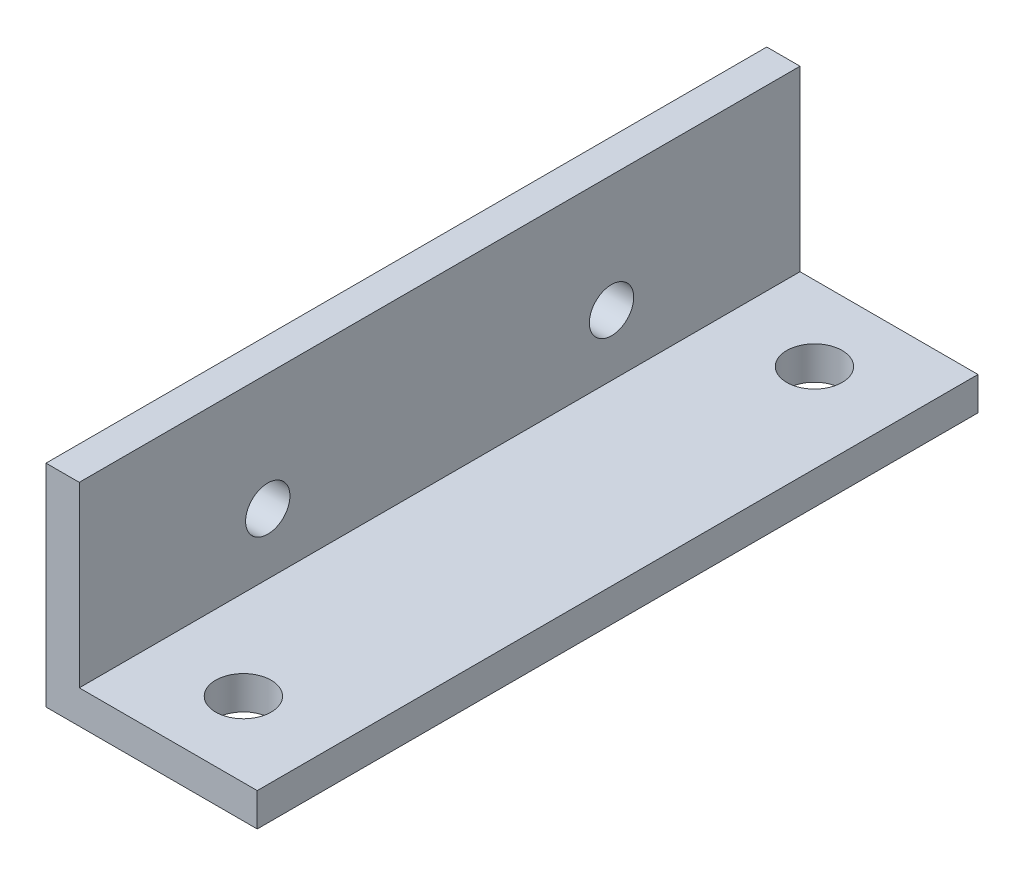
ISO-10303-21;
HEADER;
FILE_DESCRIPTION(('STEP AP214'),'2;1');
FILE_NAME('part.step','',(''),(''),'','','');
FILE_SCHEMA(('AUTOMOTIVE_DESIGN { 1 0 10303 214 1 1 1 1 }'));
ENDSEC;
DATA;
#1=APPLICATION_CONTEXT('core data for automotive mechanical design processes');
#2=APPLICATION_PROTOCOL_DEFINITION('international standard','automotive_design',2000,#1);
#3=PRODUCT_CONTEXT('',#1,'mechanical');
#4=PRODUCT('Part','Part','',(#3));
#5=PRODUCT_RELATED_PRODUCT_CATEGORY('part','',(#4));
#6=PRODUCT_DEFINITION_FORMATION('','',#4);
#7=PRODUCT_DEFINITION_CONTEXT('part definition',#1,'design');
#8=PRODUCT_DEFINITION('design','',#6,#7);
#9=PRODUCT_DEFINITION_SHAPE('','',#8);
#10=(LENGTH_UNIT() NAMED_UNIT(*) SI_UNIT(.MILLI.,.METRE.));
#11=(NAMED_UNIT(*) PLANE_ANGLE_UNIT() SI_UNIT($,.RADIAN.));
#12=(NAMED_UNIT(*) SI_UNIT($,.STERADIAN.) SOLID_ANGLE_UNIT());
#13=UNCERTAINTY_MEASURE_WITH_UNIT(LENGTH_MEASURE(1.E-05),#10,'distance_accuracy_value','');
#14=(GEOMETRIC_REPRESENTATION_CONTEXT(3) GLOBAL_UNCERTAINTY_ASSIGNED_CONTEXT((#13)) GLOBAL_UNIT_ASSIGNED_CONTEXT((#10,
#11,#12)) REPRESENTATION_CONTEXT('',''));
#15=CARTESIAN_POINT('',(0.,0.,0.));
#16=DIRECTION('',(0.,0.,1.));
#17=DIRECTION('',(1.,0.,0.));
#18=AXIS2_PLACEMENT_3D('',#15,#16,#17);
#19=CARTESIAN_POINT('',(3.,0.,32.5));
#20=DIRECTION('',(-1.,0.,0.));
#21=DIRECTION('',(0.,0.,1.));
#22=AXIS2_PLACEMENT_3D('',#19,#20,#21);
#23=PLANE('',#22);
#24=CARTESIAN_POINT('',(3.,8.5,15.5));
#25=DIRECTION('',(-1.,0.,0.));
#26=DIRECTION('',(0.,0.,1.));
#27=AXIS2_PLACEMENT_3D('',#24,#25,#26);
#28=CIRCLE('',#27,2.);
#29=CARTESIAN_POINT('',(3.,8.5,17.5));
#30=VERTEX_POINT('',#29);
#31=EDGE_CURVE('E164',#30,#30,#28,.F.);
#32=ORIENTED_EDGE('',*,*,#31,.F.);
#33=EDGE_LOOP('',(#32));
#34=FACE_BOUND('',#33,.T.);
#35=CARTESIAN_POINT('',(3.,8.5,-15.5));
#36=DIRECTION('',(-1.,0.,0.));
#37=DIRECTION('',(0.,0.,1.));
#38=AXIS2_PLACEMENT_3D('',#35,#36,#37);
#39=CIRCLE('',#38,2.);
#40=CARTESIAN_POINT('',(3.,8.5,-13.5));
#41=VERTEX_POINT('',#40);
#42=EDGE_CURVE('E120',#41,#41,#39,.F.);
#43=ORIENTED_EDGE('',*,*,#42,.F.);
#44=EDGE_LOOP('',(#43));
#45=FACE_BOUND('',#44,.T.);
#46=DIRECTION('',(0.,1.,0.));
#47=VECTOR('',#46,1.);
#48=CARTESIAN_POINT('',(3.,0.,-32.5));
#49=LINE('',#48,#47);
#50=CARTESIAN_POINT('',(3.,3.,-32.5));
#51=VERTEX_POINT('',#50);
#52=CARTESIAN_POINT('',(3.,19.05,-32.5));
#53=VERTEX_POINT('',#52);
#54=EDGE_CURVE('E116',#51,#53,#49,.T.);
#55=ORIENTED_EDGE('',*,*,#54,.T.);
#56=DIRECTION('',(0.,0.,-1.));
#57=VECTOR('',#56,1.);
#58=CARTESIAN_POINT('',(3.,19.05,32.5));
#59=LINE('',#58,#57);
#60=CARTESIAN_POINT('',(3.,19.05,32.5));
#61=VERTEX_POINT('',#60);
#62=EDGE_CURVE('E11',#61,#53,#59,.T.);
#63=ORIENTED_EDGE('',*,*,#62,.F.);
#64=DIRECTION('',(0.,1.,0.));
#65=VECTOR('',#64,1.);
#66=CARTESIAN_POINT('',(3.,0.,32.5));
#67=LINE('',#66,#65);
#68=CARTESIAN_POINT('',(3.,3.,32.5));
#69=VERTEX_POINT('',#68);
#70=EDGE_CURVE('E81',#69,#61,#67,.T.);
#71=ORIENTED_EDGE('',*,*,#70,.F.);
#72=DIRECTION('',(0.,0.,-1.));
#73=VECTOR('',#72,1.);
#74=CARTESIAN_POINT('',(3.,3.,32.5));
#75=LINE('',#74,#73);
#76=EDGE_CURVE('E112',#69,#51,#75,.T.);
#77=ORIENTED_EDGE('',*,*,#76,.T.);
#78=EDGE_LOOP('',(#55,#63,#71,#77));
#79=FACE_BOUND('',#78,.T.);
#80=ADVANCED_FACE('F35',(#34,#45,#79),#23,.F.);
#81=CARTESIAN_POINT('',(0.,19.05,32.5));
#82=DIRECTION('',(0.,1.,0.));
#83=DIRECTION('',(0.,0.,1.));
#84=AXIS2_PLACEMENT_3D('',#81,#82,#83);
#85=PLANE('',#84);
#86=DIRECTION('',(1.,0.,0.));
#87=VECTOR('',#86,1.);
#88=CARTESIAN_POINT('',(0.,19.05,-32.5));
#89=LINE('',#88,#87);
#90=CARTESIAN_POINT('',(0.,19.05,-32.5));
#91=VERTEX_POINT('',#90);
#92=EDGE_CURVE('E119',#91,#53,#89,.T.);
#93=ORIENTED_EDGE('',*,*,#92,.F.);
#94=DIRECTION('',(0.,0.,-1.));
#95=VECTOR('',#94,1.);
#96=CARTESIAN_POINT('',(0.,19.05,32.5));
#97=LINE('',#96,#95);
#98=CARTESIAN_POINT('',(0.,19.05,32.5));
#99=VERTEX_POINT('',#98);
#100=EDGE_CURVE('E43',#99,#91,#97,.T.);
#101=ORIENTED_EDGE('',*,*,#100,.F.);
#102=DIRECTION('',(1.,0.,0.));
#103=VECTOR('',#102,1.);
#104=CARTESIAN_POINT('',(0.,19.05,32.5));
#105=LINE('',#104,#103);
#106=EDGE_CURVE('E175',#99,#61,#105,.T.);
#107=ORIENTED_EDGE('',*,*,#106,.T.);
#108=ORIENTED_EDGE('',*,*,#62,.T.);
#109=EDGE_LOOP('',(#93,#101,#107,#108));
#110=FACE_BOUND('',#109,.T.);
#111=ADVANCED_FACE('F138',(#110),#85,.T.);
#112=CARTESIAN_POINT('',(0.,0.,32.5));
#113=DIRECTION('',(-1.,0.,0.));
#114=DIRECTION('',(0.,0.,1.));
#115=AXIS2_PLACEMENT_3D('',#112,#113,#114);
#116=PLANE('',#115);
#117=CARTESIAN_POINT('',(0.,8.5,15.5));
#118=DIRECTION('',(-1.,0.,0.));
#119=DIRECTION('',(0.,0.,1.));
#120=AXIS2_PLACEMENT_3D('',#117,#118,#119);
#121=CIRCLE('',#120,2.);
#122=CARTESIAN_POINT('',(0.,8.5,17.5));
#123=VERTEX_POINT('',#122);
#124=EDGE_CURVE('E177',#123,#123,#121,.T.);
#125=ORIENTED_EDGE('',*,*,#124,.F.);
#126=EDGE_LOOP('',(#125));
#127=FACE_BOUND('',#126,.T.);
#128=CARTESIAN_POINT('',(0.,8.5,-15.5));
#129=DIRECTION('',(-1.,0.,0.));
#130=DIRECTION('',(0.,0.,1.));
#131=AXIS2_PLACEMENT_3D('',#128,#129,#130);
#132=CIRCLE('',#131,2.);
#133=CARTESIAN_POINT('',(0.,8.5,-13.5));
#134=VERTEX_POINT('',#133);
#135=EDGE_CURVE('E168',#134,#134,#132,.T.);
#136=ORIENTED_EDGE('',*,*,#135,.F.);
#137=EDGE_LOOP('',(#136));
#138=FACE_BOUND('',#137,.T.);
#139=DIRECTION('',(0.,1.,0.));
#140=VECTOR('',#139,1.);
#141=CARTESIAN_POINT('',(0.,0.,-32.5));
#142=LINE('',#141,#140);
#143=CARTESIAN_POINT('',(0.,0.,-32.5));
#144=VERTEX_POINT('',#143);
#145=EDGE_CURVE('E123',#144,#91,#142,.T.);
#146=ORIENTED_EDGE('',*,*,#145,.F.);
#147=DIRECTION('',(0.,0.,-1.));
#148=VECTOR('',#147,1.);
#149=CARTESIAN_POINT('',(0.,0.,32.5));
#150=LINE('',#149,#148);
#151=CARTESIAN_POINT('',(0.,0.,32.5));
#152=VERTEX_POINT('',#151);
#153=EDGE_CURVE('E102',#152,#144,#150,.T.);
#154=ORIENTED_EDGE('',*,*,#153,.F.);
#155=DIRECTION('',(0.,1.,0.));
#156=VECTOR('',#155,1.);
#157=CARTESIAN_POINT('',(0.,0.,32.5));
#158=LINE('',#157,#156);
#159=EDGE_CURVE('E108',#152,#99,#158,.T.);
#160=ORIENTED_EDGE('',*,*,#159,.T.);
#161=ORIENTED_EDGE('',*,*,#100,.T.);
#162=EDGE_LOOP('',(#146,#154,#160,#161));
#163=FACE_BOUND('',#162,.T.);
#164=ADVANCED_FACE('F135',(#127,#138,#163),#116,.T.);
#165=CARTESIAN_POINT('',(19.05,0.,32.5));
#166=DIRECTION('',(0.,-1.,0.));
#167=DIRECTION('',(0.,0.,-1.));
#168=AXIS2_PLACEMENT_3D('',#165,#166,#167);
#169=PLANE('',#168);
#170=CARTESIAN_POINT('',(11.05,0.,25.75));
#171=DIRECTION('',(0.,-1.,0.));
#172=DIRECTION('',(0.,0.,-1.));
#173=AXIS2_PLACEMENT_3D('',#170,#171,#172);
#174=CIRCLE('',#173,2.49999999999999);
#175=CARTESIAN_POINT('',(11.05,0.,23.25));
#176=VERTEX_POINT('',#175);
#177=EDGE_CURVE('E189',#176,#176,#174,.T.);
#178=ORIENTED_EDGE('',*,*,#177,.F.);
#179=EDGE_LOOP('',(#178));
#180=FACE_BOUND('',#179,.T.);
#181=CARTESIAN_POINT('',(11.05,0.,-25.75));
#182=DIRECTION('',(0.,-1.,0.));
#183=DIRECTION('',(0.,0.,-1.));
#184=AXIS2_PLACEMENT_3D('',#181,#182,#183);
#185=CIRCLE('',#184,2.49999999999999);
#186=CARTESIAN_POINT('',(11.05,0.,-28.25));
#187=VERTEX_POINT('',#186);
#188=EDGE_CURVE('E183',#187,#187,#185,.T.);
#189=ORIENTED_EDGE('',*,*,#188,.F.);
#190=EDGE_LOOP('',(#189));
#191=FACE_BOUND('',#190,.T.);
#192=DIRECTION('',(-1.,0.,0.));
#193=VECTOR('',#192,1.);
#194=CARTESIAN_POINT('',(19.05,0.,-32.5));
#195=LINE('',#194,#193);
#196=CARTESIAN_POINT('',(19.05,0.,-32.5));
#197=VERTEX_POINT('',#196);
#198=EDGE_CURVE('E97',#197,#144,#195,.T.);
#199=ORIENTED_EDGE('',*,*,#198,.F.);
#200=DIRECTION('',(0.,0.,-1.));
#201=VECTOR('',#200,1.);
#202=CARTESIAN_POINT('',(19.05,0.,32.5));
#203=LINE('',#202,#201);
#204=CARTESIAN_POINT('',(19.05,0.,32.5));
#205=VERTEX_POINT('',#204);
#206=EDGE_CURVE('E92',#205,#197,#203,.T.);
#207=ORIENTED_EDGE('',*,*,#206,.F.);
#208=DIRECTION('',(-1.,0.,0.));
#209=VECTOR('',#208,1.);
#210=CARTESIAN_POINT('',(19.05,0.,32.5));
#211=LINE('',#210,#209);
#212=EDGE_CURVE('E95',#205,#152,#211,.T.);
#213=ORIENTED_EDGE('',*,*,#212,.T.);
#214=ORIENTED_EDGE('',*,*,#153,.T.);
#215=EDGE_LOOP('',(#199,#207,#213,#214));
#216=FACE_BOUND('',#215,.T.);
#217=ADVANCED_FACE('F94',(#180,#191,#216),#169,.T.);
#218=CARTESIAN_POINT('',(19.05,3.,32.5));
#219=DIRECTION('',(1.,0.,0.));
#220=DIRECTION('',(0.,0.,-1.));
#221=AXIS2_PLACEMENT_3D('',#218,#219,#220);
#222=PLANE('',#221);
#223=DIRECTION('',(0.,-1.,0.));
#224=VECTOR('',#223,1.);
#225=CARTESIAN_POINT('',(19.05,3.,-32.5));
#226=LINE('',#225,#224);
#227=CARTESIAN_POINT('',(19.05,3.,-32.5));
#228=VERTEX_POINT('',#227);
#229=EDGE_CURVE('E127',#228,#197,#226,.T.);
#230=ORIENTED_EDGE('',*,*,#229,.F.);
#231=DIRECTION('',(0.,0.,-1.));
#232=VECTOR('',#231,1.);
#233=CARTESIAN_POINT('',(19.05,3.,32.5));
#234=LINE('',#233,#232);
#235=CARTESIAN_POINT('',(19.05,3.,32.5));
#236=VERTEX_POINT('',#235);
#237=EDGE_CURVE('E72',#236,#228,#234,.T.);
#238=ORIENTED_EDGE('',*,*,#237,.F.);
#239=DIRECTION('',(0.,-1.,0.));
#240=VECTOR('',#239,1.);
#241=CARTESIAN_POINT('',(19.05,3.,32.5));
#242=LINE('',#241,#240);
#243=EDGE_CURVE('E106',#236,#205,#242,.T.);
#244=ORIENTED_EDGE('',*,*,#243,.T.);
#245=ORIENTED_EDGE('',*,*,#206,.T.);
#246=EDGE_LOOP('',(#230,#238,#244,#245));
#247=FACE_BOUND('',#246,.T.);
#248=ADVANCED_FACE('F110',(#247),#222,.T.);
#249=CARTESIAN_POINT('',(19.05,3.,32.5));
#250=DIRECTION('',(0.,-1.,0.));
#251=DIRECTION('',(0.,0.,-1.));
#252=AXIS2_PLACEMENT_3D('',#249,#250,#251);
#253=PLANE('',#252);
#254=CARTESIAN_POINT('',(11.05,3.,25.75));
#255=DIRECTION('',(0.,-1.,0.));
#256=DIRECTION('',(0.,0.,-1.));
#257=AXIS2_PLACEMENT_3D('',#254,#255,#256);
#258=CIRCLE('',#257,2.49999999999999);
#259=CARTESIAN_POINT('',(11.05,3.,23.25));
#260=VERTEX_POINT('',#259);
#261=EDGE_CURVE('E186',#260,#260,#258,.F.);
#262=ORIENTED_EDGE('',*,*,#261,.F.);
#263=EDGE_LOOP('',(#262));
#264=FACE_BOUND('',#263,.T.);
#265=CARTESIAN_POINT('',(11.05,3.,-25.75));
#266=DIRECTION('',(0.,-1.,0.));
#267=DIRECTION('',(0.,0.,-1.));
#268=AXIS2_PLACEMENT_3D('',#265,#266,#267);
#269=CIRCLE('',#268,2.49999999999999);
#270=CARTESIAN_POINT('',(11.05,3.,-28.25));
#271=VERTEX_POINT('',#270);
#272=EDGE_CURVE('E180',#271,#271,#269,.F.);
#273=ORIENTED_EDGE('',*,*,#272,.F.);
#274=EDGE_LOOP('',(#273));
#275=FACE_BOUND('',#274,.T.);
#276=DIRECTION('',(1.,0.,0.));
#277=VECTOR('',#276,1.);
#278=CARTESIAN_POINT('',(19.05,3.,-32.5));
#279=LINE('',#278,#277);
#280=EDGE_CURVE('E75',#228,#51,#279,.F.);
#281=ORIENTED_EDGE('',*,*,#280,.T.);
#282=ORIENTED_EDGE('',*,*,#76,.F.);
#283=DIRECTION('',(1.,0.,0.));
#284=VECTOR('',#283,1.);
#285=CARTESIAN_POINT('',(19.05,3.,32.5));
#286=LINE('',#285,#284);
#287=EDGE_CURVE('E51',#236,#69,#286,.F.);
#288=ORIENTED_EDGE('',*,*,#287,.F.);
#289=ORIENTED_EDGE('',*,*,#237,.T.);
#290=EDGE_LOOP('',(#281,#282,#288,#289));
#291=FACE_BOUND('',#290,.T.);
#292=ADVANCED_FACE('F143',(#264,#275,#291),#253,.F.);
#293=CARTESIAN_POINT('',(0.,0.,32.5));
#294=DIRECTION('',(0.,0.,-1.));
#295=DIRECTION('',(-1.,0.,0.));
#296=AXIS2_PLACEMENT_3D('',#293,#294,#295);
#297=PLANE('',#296);
#298=ORIENTED_EDGE('',*,*,#70,.T.);
#299=ORIENTED_EDGE('',*,*,#106,.F.);
#300=ORIENTED_EDGE('',*,*,#159,.F.);
#301=ORIENTED_EDGE('',*,*,#212,.F.);
#302=ORIENTED_EDGE('',*,*,#243,.F.);
#303=ORIENTED_EDGE('',*,*,#287,.T.);
#304=EDGE_LOOP('',(#298,#299,#300,#301,#302,#303));
#305=FACE_BOUND('',#304,.T.);
#306=ADVANCED_FACE('F105',(#305),#297,.F.);
#307=CARTESIAN_POINT('',(0.,0.,-32.5));
#308=DIRECTION('',(0.,0.,-1.));
#309=DIRECTION('',(-1.,0.,0.));
#310=AXIS2_PLACEMENT_3D('',#307,#308,#309);
#311=PLANE('',#310);
#312=ORIENTED_EDGE('',*,*,#54,.F.);
#313=ORIENTED_EDGE('',*,*,#280,.F.);
#314=ORIENTED_EDGE('',*,*,#229,.T.);
#315=ORIENTED_EDGE('',*,*,#198,.T.);
#316=ORIENTED_EDGE('',*,*,#145,.T.);
#317=ORIENTED_EDGE('',*,*,#92,.T.);
#318=EDGE_LOOP('',(#312,#313,#314,#315,#316,#317));
#319=FACE_BOUND('',#318,.T.);
#320=ADVANCED_FACE('F141',(#319),#311,.T.);
#321=CARTESIAN_POINT('',(19.051,8.5,-15.5));
#322=DIRECTION('',(-1.,0.,0.));
#323=DIRECTION('',(0.,0.,1.));
#324=AXIS2_PLACEMENT_3D('',#321,#322,#323);
#325=CYLINDRICAL_SURFACE('',#324,2.);
#326=ORIENTED_EDGE('',*,*,#135,.T.);
#327=EDGE_LOOP('',(#326));
#328=FACE_BOUND('',#327,.T.);
#329=ORIENTED_EDGE('',*,*,#42,.T.);
#330=EDGE_LOOP('',(#329));
#331=FACE_BOUND('',#330,.T.);
#332=ADVANCED_FACE('F211',(#328,#331),#325,.F.);
#333=CARTESIAN_POINT('',(19.051,8.5,15.5));
#334=DIRECTION('',(-1.,0.,0.));
#335=DIRECTION('',(0.,0.,1.));
#336=AXIS2_PLACEMENT_3D('',#333,#334,#335);
#337=CYLINDRICAL_SURFACE('',#336,2.);
#338=ORIENTED_EDGE('',*,*,#124,.T.);
#339=EDGE_LOOP('',(#338));
#340=FACE_BOUND('',#339,.T.);
#341=ORIENTED_EDGE('',*,*,#31,.T.);
#342=EDGE_LOOP('',(#341));
#343=FACE_BOUND('',#342,.T.);
#344=ADVANCED_FACE('F202',(#340,#343),#337,.F.);
#345=CARTESIAN_POINT('',(11.05,10.0710678118655,-25.75));
#346=DIRECTION('',(0.,-1.,0.));
#347=DIRECTION('',(0.,0.,-1.));
#348=AXIS2_PLACEMENT_3D('',#345,#346,#347);
#349=CYLINDRICAL_SURFACE('',#348,2.49999999999999);
#350=ORIENTED_EDGE('',*,*,#272,.T.);
#351=EDGE_LOOP('',(#350));
#352=FACE_BOUND('',#351,.T.);
#353=ORIENTED_EDGE('',*,*,#188,.T.);
#354=EDGE_LOOP('',(#353));
#355=FACE_BOUND('',#354,.T.);
#356=ADVANCED_FACE('F200',(#352,#355),#349,.F.);
#357=CARTESIAN_POINT('',(11.05,10.0710678118655,25.75));
#358=DIRECTION('',(0.,-1.,0.));
#359=DIRECTION('',(0.,0.,-1.));
#360=AXIS2_PLACEMENT_3D('',#357,#358,#359);
#361=CYLINDRICAL_SURFACE('',#360,2.49999999999999);
#362=ORIENTED_EDGE('',*,*,#261,.T.);
#363=EDGE_LOOP('',(#362));
#364=FACE_BOUND('',#363,.T.);
#365=ORIENTED_EDGE('',*,*,#177,.T.);
#366=EDGE_LOOP('',(#365));
#367=FACE_BOUND('',#366,.T.);
#368=ADVANCED_FACE('F193',(#364,#367),#361,.F.);
#369=CLOSED_SHELL('',(#80,#111,#164,#217,#248,#292,#306,#320,#332,#344,#356,#368));
#370=MANIFOLD_SOLID_BREP('B2',#369);
#371=ADVANCED_BREP_SHAPE_REPRESENTATION('',(#18,#370),#14);
#372=SHAPE_DEFINITION_REPRESENTATION(#9,#371);
ENDSEC;
END-ISO-10303-21;
